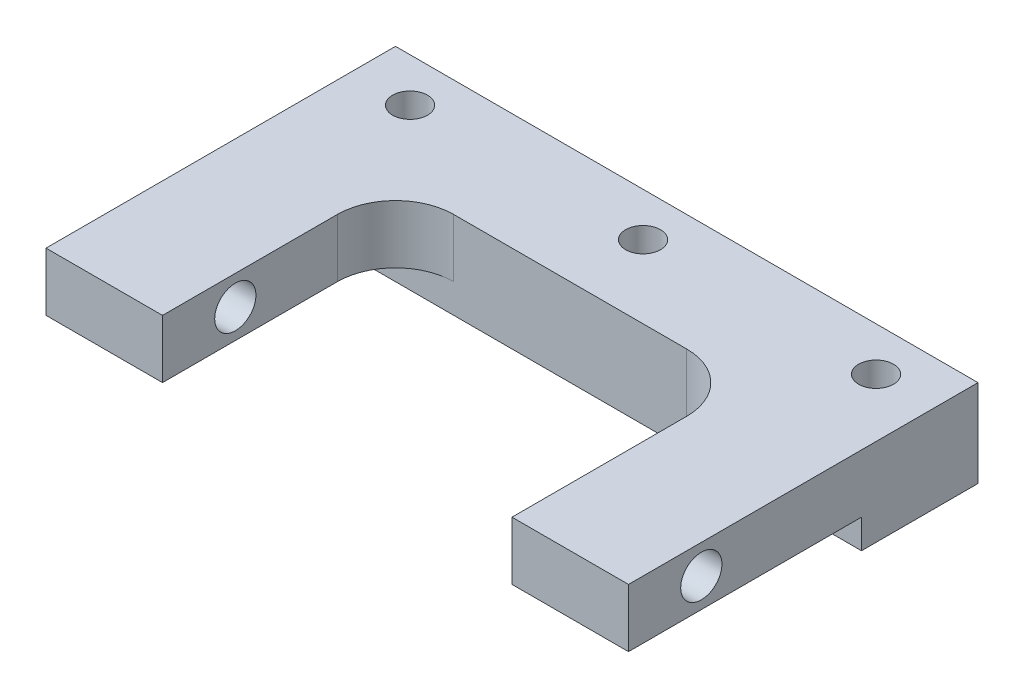
ISO-10303-21;
HEADER;
FILE_DESCRIPTION(('STEP AP214'),'2;1');
FILE_NAME('part.step','',(''),(''),'','','');
FILE_SCHEMA(('AUTOMOTIVE_DESIGN { 1 0 10303 214 1 1 1 1 }'));
ENDSEC;
DATA;
#1=APPLICATION_CONTEXT('core data for automotive mechanical design processes');
#2=APPLICATION_PROTOCOL_DEFINITION('international standard','automotive_design',2000,#1);
#3=PRODUCT_CONTEXT('',#1,'mechanical');
#4=PRODUCT('Part','Part','',(#3));
#5=PRODUCT_RELATED_PRODUCT_CATEGORY('part','',(#4));
#6=PRODUCT_DEFINITION_FORMATION('','',#4);
#7=PRODUCT_DEFINITION_CONTEXT('part definition',#1,'design');
#8=PRODUCT_DEFINITION('design','',#6,#7);
#9=PRODUCT_DEFINITION_SHAPE('','',#8);
#10=(LENGTH_UNIT() NAMED_UNIT(*) SI_UNIT(.MILLI.,.METRE.));
#11=(NAMED_UNIT(*) PLANE_ANGLE_UNIT() SI_UNIT($,.RADIAN.));
#12=(NAMED_UNIT(*) SI_UNIT($,.STERADIAN.) SOLID_ANGLE_UNIT());
#13=UNCERTAINTY_MEASURE_WITH_UNIT(LENGTH_MEASURE(1.E-05),#10,'distance_accuracy_value','');
#14=(GEOMETRIC_REPRESENTATION_CONTEXT(3) GLOBAL_UNCERTAINTY_ASSIGNED_CONTEXT((#13)) GLOBAL_UNIT_ASSIGNED_CONTEXT((#10,
#11,#12)) REPRESENTATION_CONTEXT('',''));
#15=CARTESIAN_POINT('',(0.,0.,0.));
#16=DIRECTION('',(0.,0.,1.));
#17=DIRECTION('',(1.,0.,0.));
#18=AXIS2_PLACEMENT_3D('',#15,#16,#17);
#19=CARTESIAN_POINT('',(0.,0.,12.7));
#20=DIRECTION('',(0.,0.,-1.));
#21=DIRECTION('',(-1.,0.,0.));
#22=AXIS2_PLACEMENT_3D('',#19,#20,#21);
#23=PLANE('',#22);
#24=DIRECTION('',(-1.,0.,0.));
#25=VECTOR('',#24,1.);
#26=CARTESIAN_POINT('',(0.,9.525,12.7));
#27=LINE('',#26,#25);
#28=CARTESIAN_POINT('',(44.45,9.525,12.7));
#29=VERTEX_POINT('',#28);
#30=CARTESIAN_POINT('',(19.05,9.525,12.7));
#31=VERTEX_POINT('',#30);
#32=EDGE_CURVE('E210',#29,#31,#27,.T.);
#33=ORIENTED_EDGE('',*,*,#32,.T.);
#34=DIRECTION('',(0.,1.,0.));
#35=VECTOR('',#34,1.);
#36=CARTESIAN_POINT('',(19.05,3.175,12.7));
#37=LINE('',#36,#35);
#38=CARTESIAN_POINT('',(19.05,3.175,12.7));
#39=VERTEX_POINT('',#38);
#40=EDGE_CURVE('E230',#31,#39,#37,.F.);
#41=ORIENTED_EDGE('',*,*,#40,.T.);
#42=DIRECTION('',(1.,0.,0.));
#43=VECTOR('',#42,1.);
#44=CARTESIAN_POINT('',(0.,3.175,12.7));
#45=LINE('',#44,#43);
#46=CARTESIAN_POINT('',(0.,3.175,12.7));
#47=VERTEX_POINT('',#46);
#48=EDGE_CURVE('E163',#47,#39,#45,.T.);
#49=ORIENTED_EDGE('',*,*,#48,.F.);
#50=DIRECTION('',(0.,-1.,0.));
#51=VECTOR('',#50,1.);
#52=CARTESIAN_POINT('',(0.,0.,12.7));
#53=LINE('',#52,#51);
#54=CARTESIAN_POINT('',(0.,0.,12.7));
#55=VERTEX_POINT('',#54);
#56=EDGE_CURVE('E203',#47,#55,#53,.T.);
#57=ORIENTED_EDGE('',*,*,#56,.T.);
#58=DIRECTION('',(1.,0.,0.));
#59=VECTOR('',#58,1.);
#60=CARTESIAN_POINT('',(0.,0.,12.7));
#61=LINE('',#60,#59);
#62=CARTESIAN_POINT('',(63.5,0.,12.7));
#63=VERTEX_POINT('',#62);
#64=EDGE_CURVE('E205',#55,#63,#61,.T.);
#65=ORIENTED_EDGE('',*,*,#64,.T.);
#66=DIRECTION('',(0.,1.,0.));
#67=VECTOR('',#66,1.);
#68=CARTESIAN_POINT('',(63.5,0.,12.7));
#69=LINE('',#68,#67);
#70=CARTESIAN_POINT('',(63.5,3.175,12.7));
#71=VERTEX_POINT('',#70);
#72=EDGE_CURVE('E208',#63,#71,#69,.T.);
#73=ORIENTED_EDGE('',*,*,#72,.T.);
#74=DIRECTION('',(1.,0.,0.));
#75=VECTOR('',#74,1.);
#76=CARTESIAN_POINT('',(63.5,3.175,12.7));
#77=LINE('',#76,#75);
#78=CARTESIAN_POINT('',(44.45,3.175,12.7));
#79=VERTEX_POINT('',#78);
#80=EDGE_CURVE('E147',#79,#71,#77,.T.);
#81=ORIENTED_EDGE('',*,*,#80,.F.);
#82=DIRECTION('',(0.,-1.,0.));
#83=VECTOR('',#82,1.);
#84=CARTESIAN_POINT('',(44.45,9.52500000000001,12.7));
#85=LINE('',#84,#83);
#86=EDGE_CURVE('E228',#79,#29,#85,.F.);
#87=ORIENTED_EDGE('',*,*,#86,.T.);
#88=EDGE_LOOP('',(#33,#41,#49,#57,#65,#73,#81,#87));
#89=FACE_BOUND('',#88,.T.);
#90=ADVANCED_FACE('F33',(#89),#23,.F.);
#91=CARTESIAN_POINT('',(0.,0.,12.7));
#92=DIRECTION('',(1.,0.,0.));
#93=DIRECTION('',(0.,0.,-1.));
#94=AXIS2_PLACEMENT_3D('',#91,#92,#93);
#95=PLANE('',#94);
#96=CARTESIAN_POINT('',(0.,6.35,30.1625));
#97=DIRECTION('',(-1.,0.,0.));
#98=DIRECTION('',(0.,0.,1.));
#99=AXIS2_PLACEMENT_3D('',#96,#97,#98);
#100=CIRCLE('',#99,2.24789999999999);
#101=CARTESIAN_POINT('',(0.,6.35,32.4104));
#102=VERTEX_POINT('',#101);
#103=EDGE_CURVE('E470',#102,#102,#100,.T.);
#104=ORIENTED_EDGE('',*,*,#103,.F.);
#105=EDGE_LOOP('',(#104));
#106=FACE_BOUND('',#105,.T.);
#107=DIRECTION('',(0.,-1.,0.));
#108=VECTOR('',#107,1.);
#109=CARTESIAN_POINT('',(0.,0.,0.));
#110=LINE('',#109,#108);
#111=CARTESIAN_POINT('',(0.,9.525,0.));
#112=VERTEX_POINT('',#111);
#113=CARTESIAN_POINT('',(0.,0.,0.));
#114=VERTEX_POINT('',#113);
#115=EDGE_CURVE('E202',#112,#114,#110,.T.);
#116=ORIENTED_EDGE('',*,*,#115,.T.);
#117=DIRECTION('',(0.,0.,-1.));
#118=VECTOR('',#117,1.);
#119=CARTESIAN_POINT('',(0.,0.,12.7));
#120=LINE('',#119,#118);
#121=EDGE_CURVE('E222',#55,#114,#120,.T.);
#122=ORIENTED_EDGE('',*,*,#121,.F.);
#123=ORIENTED_EDGE('',*,*,#56,.F.);
#124=DIRECTION('',(0.,0.,-1.));
#125=VECTOR('',#124,1.);
#126=CARTESIAN_POINT('',(0.,3.175,38.1));
#127=LINE('',#126,#125);
#128=CARTESIAN_POINT('',(0.,3.175,38.1));
#129=VERTEX_POINT('',#128);
#130=EDGE_CURVE('E181',#129,#47,#127,.T.);
#131=ORIENTED_EDGE('',*,*,#130,.F.);
#132=DIRECTION('',(0.,-1.,0.));
#133=VECTOR('',#132,1.);
#134=CARTESIAN_POINT('',(0.,9.525,38.1));
#135=LINE('',#134,#133);
#136=CARTESIAN_POINT('',(0.,9.525,38.1));
#137=VERTEX_POINT('',#136);
#138=EDGE_CURVE('E164',#137,#129,#135,.T.);
#139=ORIENTED_EDGE('',*,*,#138,.F.);
#140=DIRECTION('',(0.,0.,-1.));
#141=VECTOR('',#140,1.);
#142=CARTESIAN_POINT('',(0.,9.525,12.7));
#143=LINE('',#142,#141);
#144=EDGE_CURVE('E134',#137,#112,#143,.T.);
#145=ORIENTED_EDGE('',*,*,#144,.T.);
#146=EDGE_LOOP('',(#116,#122,#123,#131,#139,#145));
#147=FACE_BOUND('',#146,.T.);
#148=ADVANCED_FACE('F260',(#106,#147),#95,.F.);
#149=CARTESIAN_POINT('',(0.,0.,12.7));
#150=DIRECTION('',(0.,1.,0.));
#151=DIRECTION('',(0.,0.,1.));
#152=AXIS2_PLACEMENT_3D('',#149,#150,#151);
#153=PLANE('',#152);
#154=CARTESIAN_POINT('',(6.35,0.,4.7625));
#155=DIRECTION('',(0.,1.,0.));
#156=DIRECTION('',(0.,0.,1.));
#157=AXIS2_PLACEMENT_3D('',#154,#155,#156);
#158=CIRCLE('',#157,1.89865);
#159=CARTESIAN_POINT('',(6.35,0.,6.66115));
#160=VERTEX_POINT('',#159);
#161=EDGE_CURVE('E187',#160,#160,#158,.T.);
#162=ORIENTED_EDGE('',*,*,#161,.T.);
#163=EDGE_LOOP('',(#162));
#164=FACE_BOUND('',#163,.T.);
#165=CARTESIAN_POINT('',(31.75,0.,4.7625));
#166=DIRECTION('',(0.,1.,0.));
#167=DIRECTION('',(0.,0.,1.));
#168=AXIS2_PLACEMENT_3D('',#165,#166,#167);
#169=CIRCLE('',#168,1.89864999999999);
#170=CARTESIAN_POINT('',(31.75,0.,6.66114999999999));
#171=VERTEX_POINT('',#170);
#172=EDGE_CURVE('E193',#171,#171,#169,.T.);
#173=ORIENTED_EDGE('',*,*,#172,.T.);
#174=EDGE_LOOP('',(#173));
#175=FACE_BOUND('',#174,.T.);
#176=CARTESIAN_POINT('',(57.15,0.,4.7625));
#177=DIRECTION('',(0.,1.,0.));
#178=DIRECTION('',(0.,0.,1.));
#179=AXIS2_PLACEMENT_3D('',#176,#177,#178);
#180=CIRCLE('',#179,1.89864999999999);
#181=CARTESIAN_POINT('',(57.15,0.,6.66114999999999));
#182=VERTEX_POINT('',#181);
#183=EDGE_CURVE('E199',#182,#182,#180,.T.);
#184=ORIENTED_EDGE('',*,*,#183,.T.);
#185=EDGE_LOOP('',(#184));
#186=FACE_BOUND('',#185,.T.);
#187=DIRECTION('',(1.,0.,0.));
#188=VECTOR('',#187,1.);
#189=CARTESIAN_POINT('',(0.,0.,0.));
#190=LINE('',#189,#188);
#191=CARTESIAN_POINT('',(63.5,0.,0.));
#192=VERTEX_POINT('',#191);
#193=EDGE_CURVE('E215',#114,#192,#190,.T.);
#194=ORIENTED_EDGE('',*,*,#193,.T.);
#195=DIRECTION('',(0.,0.,-1.));
#196=VECTOR('',#195,1.);
#197=CARTESIAN_POINT('',(63.5,0.,12.7));
#198=LINE('',#197,#196);
#199=EDGE_CURVE('E133',#63,#192,#198,.T.);
#200=ORIENTED_EDGE('',*,*,#199,.F.);
#201=ORIENTED_EDGE('',*,*,#64,.F.);
#202=ORIENTED_EDGE('',*,*,#121,.T.);
#203=EDGE_LOOP('',(#194,#200,#201,#202));
#204=FACE_BOUND('',#203,.T.);
#205=ADVANCED_FACE('F264',(#164,#175,#186,#204),#153,.F.);
#206=CARTESIAN_POINT('',(63.5,0.,12.7));
#207=DIRECTION('',(-1.,0.,0.));
#208=DIRECTION('',(0.,0.,1.));
#209=AXIS2_PLACEMENT_3D('',#206,#207,#208);
#210=PLANE('',#209);
#211=CARTESIAN_POINT('',(63.5,6.35,30.1625));
#212=DIRECTION('',(-1.,0.,0.));
#213=DIRECTION('',(0.,0.,1.));
#214=AXIS2_PLACEMENT_3D('',#211,#212,#213);
#215=CIRCLE('',#214,2.24789999999999);
#216=CARTESIAN_POINT('',(63.5,6.35,32.4104));
#217=VERTEX_POINT('',#216);
#218=EDGE_CURVE('E465',#217,#217,#215,.T.);
#219=ORIENTED_EDGE('',*,*,#218,.T.);
#220=EDGE_LOOP('',(#219));
#221=FACE_BOUND('',#220,.T.);
#222=DIRECTION('',(0.,1.,0.));
#223=VECTOR('',#222,1.);
#224=CARTESIAN_POINT('',(63.5,0.,0.));
#225=LINE('',#224,#223);
#226=CARTESIAN_POINT('',(63.5,9.525,0.));
#227=VERTEX_POINT('',#226);
#228=EDGE_CURVE('E131',#192,#227,#225,.T.);
#229=ORIENTED_EDGE('',*,*,#228,.T.);
#230=DIRECTION('',(0.,0.,-1.));
#231=VECTOR('',#230,1.);
#232=CARTESIAN_POINT('',(63.5,9.525,12.7));
#233=LINE('',#232,#231);
#234=CARTESIAN_POINT('',(63.5,9.525,38.1));
#235=VERTEX_POINT('',#234);
#236=EDGE_CURVE('E123',#235,#227,#233,.T.);
#237=ORIENTED_EDGE('',*,*,#236,.F.);
#238=DIRECTION('',(0.,1.,0.));
#239=VECTOR('',#238,1.);
#240=CARTESIAN_POINT('',(63.5,9.525,38.1));
#241=LINE('',#240,#239);
#242=CARTESIAN_POINT('',(63.5,3.175,38.1));
#243=VERTEX_POINT('',#242);
#244=EDGE_CURVE('E128',#243,#235,#241,.T.);
#245=ORIENTED_EDGE('',*,*,#244,.F.);
#246=DIRECTION('',(0.,0.,-1.));
#247=VECTOR('',#246,1.);
#248=CARTESIAN_POINT('',(63.5,3.175,38.1));
#249=LINE('',#248,#247);
#250=EDGE_CURVE('E156',#243,#71,#249,.T.);
#251=ORIENTED_EDGE('',*,*,#250,.T.);
#252=ORIENTED_EDGE('',*,*,#72,.F.);
#253=ORIENTED_EDGE('',*,*,#199,.T.);
#254=EDGE_LOOP('',(#229,#237,#245,#251,#252,#253));
#255=FACE_BOUND('',#254,.T.);
#256=ADVANCED_FACE('F125',(#221,#255),#210,.F.);
#257=CARTESIAN_POINT('',(0.,9.525,12.7));
#258=DIRECTION('',(0.,-1.,0.));
#259=DIRECTION('',(0.,0.,-1.));
#260=AXIS2_PLACEMENT_3D('',#257,#258,#259);
#261=PLANE('',#260);
#262=CARTESIAN_POINT('',(6.35,9.525,4.7625));
#263=DIRECTION('',(0.,1.,0.));
#264=DIRECTION('',(0.,0.,1.));
#265=AXIS2_PLACEMENT_3D('',#262,#263,#264);
#266=CIRCLE('',#265,1.89865);
#267=CARTESIAN_POINT('',(6.35,9.525,6.66115));
#268=VERTEX_POINT('',#267);
#269=EDGE_CURVE('E184',#268,#268,#266,.T.);
#270=ORIENTED_EDGE('',*,*,#269,.F.);
#271=EDGE_LOOP('',(#270));
#272=FACE_BOUND('',#271,.T.);
#273=CARTESIAN_POINT('',(31.75,9.525,4.7625));
#274=DIRECTION('',(0.,1.,0.));
#275=DIRECTION('',(0.,0.,1.));
#276=AXIS2_PLACEMENT_3D('',#273,#274,#275);
#277=CIRCLE('',#276,1.89864999999999);
#278=CARTESIAN_POINT('',(31.75,9.525,6.66114999999999));
#279=VERTEX_POINT('',#278);
#280=EDGE_CURVE('E190',#279,#279,#277,.T.);
#281=ORIENTED_EDGE('',*,*,#280,.F.);
#282=EDGE_LOOP('',(#281));
#283=FACE_BOUND('',#282,.T.);
#284=CARTESIAN_POINT('',(57.15,9.525,4.7625));
#285=DIRECTION('',(0.,1.,0.));
#286=DIRECTION('',(0.,0.,1.));
#287=AXIS2_PLACEMENT_3D('',#284,#285,#286);
#288=CIRCLE('',#287,1.89864999999999);
#289=CARTESIAN_POINT('',(57.15,9.525,6.66114999999999));
#290=VERTEX_POINT('',#289);
#291=EDGE_CURVE('E196',#290,#290,#288,.T.);
#292=ORIENTED_EDGE('',*,*,#291,.F.);
#293=EDGE_LOOP('',(#292));
#294=FACE_BOUND('',#293,.T.);
#295=DIRECTION('',(-1.,0.,0.));
#296=VECTOR('',#295,1.);
#297=CARTESIAN_POINT('',(0.,9.525,0.));
#298=LINE('',#297,#296);
#299=EDGE_CURVE('E206',#227,#112,#298,.T.);
#300=ORIENTED_EDGE('',*,*,#299,.T.);
#301=ORIENTED_EDGE('',*,*,#144,.F.);
#302=DIRECTION('',(-1.,0.,0.));
#303=VECTOR('',#302,1.);
#304=CARTESIAN_POINT('',(0.,9.525,38.1));
#305=LINE('',#304,#303);
#306=CARTESIAN_POINT('',(12.7,9.525,38.1));
#307=VERTEX_POINT('',#306);
#308=EDGE_CURVE('E171',#307,#137,#305,.T.);
#309=ORIENTED_EDGE('',*,*,#308,.F.);
#310=DIRECTION('',(0.,0.,-1.));
#311=VECTOR('',#310,1.);
#312=CARTESIAN_POINT('',(12.7,9.525,38.1));
#313=LINE('',#312,#311);
#314=CARTESIAN_POINT('',(12.7,9.525,19.05));
#315=VERTEX_POINT('',#314);
#316=EDGE_CURVE('E174',#307,#315,#313,.T.);
#317=ORIENTED_EDGE('',*,*,#316,.T.);
#318=CARTESIAN_POINT('',(19.05,9.525,19.05));
#319=DIRECTION('',(0.,-1.,0.));
#320=DIRECTION('',(0.,0.,-1.));
#321=AXIS2_PLACEMENT_3D('',#318,#319,#320);
#322=CIRCLE('',#321,6.35);
#323=EDGE_CURVE('E235',#315,#31,#322,.T.);
#324=ORIENTED_EDGE('',*,*,#323,.T.);
#325=ORIENTED_EDGE('',*,*,#32,.F.);
#326=CARTESIAN_POINT('',(44.45,9.525,19.05));
#327=DIRECTION('',(0.,-1.,0.));
#328=DIRECTION('',(0.,0.,-1.));
#329=AXIS2_PLACEMENT_3D('',#326,#327,#328);
#330=CIRCLE('',#329,6.35);
#331=CARTESIAN_POINT('',(50.8,9.525,19.05));
#332=VERTEX_POINT('',#331);
#333=EDGE_CURVE('E11',#29,#332,#330,.T.);
#334=ORIENTED_EDGE('',*,*,#333,.T.);
#335=DIRECTION('',(0.,0.,-1.));
#336=VECTOR('',#335,1.);
#337=CARTESIAN_POINT('',(50.8,9.525,38.1));
#338=LINE('',#337,#336);
#339=CARTESIAN_POINT('',(50.8,9.525,38.1));
#340=VERTEX_POINT('',#339);
#341=EDGE_CURVE('E138',#340,#332,#338,.T.);
#342=ORIENTED_EDGE('',*,*,#341,.F.);
#343=DIRECTION('',(-1.,0.,0.));
#344=VECTOR('',#343,1.);
#345=CARTESIAN_POINT('',(63.5,9.525,38.1));
#346=LINE('',#345,#344);
#347=EDGE_CURVE('E136',#235,#340,#346,.T.);
#348=ORIENTED_EDGE('',*,*,#347,.F.);
#349=ORIENTED_EDGE('',*,*,#236,.T.);
#350=EDGE_LOOP('',(#300,#301,#309,#317,#324,#325,#334,#342,#348,#349));
#351=FACE_BOUND('',#350,.T.);
#352=ADVANCED_FACE('F137',(#272,#283,#294,#351),#261,.F.);
#353=CARTESIAN_POINT('',(0.,0.,0.));
#354=DIRECTION('',(0.,0.,-1.));
#355=DIRECTION('',(-1.,0.,0.));
#356=AXIS2_PLACEMENT_3D('',#353,#354,#355);
#357=PLANE('',#356);
#358=ORIENTED_EDGE('',*,*,#115,.F.);
#359=ORIENTED_EDGE('',*,*,#299,.F.);
#360=ORIENTED_EDGE('',*,*,#228,.F.);
#361=ORIENTED_EDGE('',*,*,#193,.F.);
#362=EDGE_LOOP('',(#358,#359,#360,#361));
#363=FACE_BOUND('',#362,.T.);
#364=ADVANCED_FACE('F268',(#363),#357,.T.);
#365=CARTESIAN_POINT('',(57.15,9.525,4.7625));
#366=DIRECTION('',(0.,1.,0.));
#367=DIRECTION('',(0.,0.,1.));
#368=AXIS2_PLACEMENT_3D('',#365,#366,#367);
#369=CYLINDRICAL_SURFACE('',#368,1.89864999999999);
#370=ORIENTED_EDGE('',*,*,#183,.F.);
#371=EDGE_LOOP('',(#370));
#372=FACE_BOUND('',#371,.T.);
#373=ORIENTED_EDGE('',*,*,#291,.T.);
#374=EDGE_LOOP('',(#373));
#375=FACE_BOUND('',#374,.T.);
#376=ADVANCED_FACE('F291',(#372,#375),#369,.F.);
#377=CARTESIAN_POINT('',(31.75,9.525,4.7625));
#378=DIRECTION('',(0.,1.,0.));
#379=DIRECTION('',(0.,0.,1.));
#380=AXIS2_PLACEMENT_3D('',#377,#378,#379);
#381=CYLINDRICAL_SURFACE('',#380,1.89864999999999);
#382=ORIENTED_EDGE('',*,*,#172,.F.);
#383=EDGE_LOOP('',(#382));
#384=FACE_BOUND('',#383,.T.);
#385=ORIENTED_EDGE('',*,*,#280,.T.);
#386=EDGE_LOOP('',(#385));
#387=FACE_BOUND('',#386,.T.);
#388=ADVANCED_FACE('F391',(#384,#387),#381,.F.);
#389=CARTESIAN_POINT('',(6.35,9.525,4.7625));
#390=DIRECTION('',(0.,1.,0.));
#391=DIRECTION('',(0.,0.,1.));
#392=AXIS2_PLACEMENT_3D('',#389,#390,#391);
#393=CYLINDRICAL_SURFACE('',#392,1.89865);
#394=ORIENTED_EDGE('',*,*,#161,.F.);
#395=EDGE_LOOP('',(#394));
#396=FACE_BOUND('',#395,.T.);
#397=ORIENTED_EDGE('',*,*,#269,.T.);
#398=EDGE_LOOP('',(#397));
#399=FACE_BOUND('',#398,.T.);
#400=ADVANCED_FACE('F365',(#396,#399),#393,.F.);
#401=CARTESIAN_POINT('',(0.,3.175,38.1));
#402=DIRECTION('',(0.,1.,0.));
#403=DIRECTION('',(0.,0.,1.));
#404=AXIS2_PLACEMENT_3D('',#401,#402,#403);
#405=PLANE('',#404);
#406=ORIENTED_EDGE('',*,*,#48,.T.);
#407=CARTESIAN_POINT('',(19.05,3.175,19.05));
#408=DIRECTION('',(0.,1.,0.));
#409=DIRECTION('',(0.,0.,1.));
#410=AXIS2_PLACEMENT_3D('',#407,#408,#409);
#411=CIRCLE('',#410,6.35);
#412=CARTESIAN_POINT('',(12.7,3.175,19.05));
#413=VERTEX_POINT('',#412);
#414=EDGE_CURVE('E237',#39,#413,#411,.T.);
#415=ORIENTED_EDGE('',*,*,#414,.T.);
#416=DIRECTION('',(0.,0.,-1.));
#417=VECTOR('',#416,1.);
#418=CARTESIAN_POINT('',(12.7,3.175,38.1));
#419=LINE('',#418,#417);
#420=CARTESIAN_POINT('',(12.7,3.175,38.1));
#421=VERTEX_POINT('',#420);
#422=EDGE_CURVE('E178',#421,#413,#419,.T.);
#423=ORIENTED_EDGE('',*,*,#422,.F.);
#424=DIRECTION('',(1.,0.,0.));
#425=VECTOR('',#424,1.);
#426=CARTESIAN_POINT('',(0.,3.175,38.1));
#427=LINE('',#426,#425);
#428=EDGE_CURVE('E167',#129,#421,#427,.T.);
#429=ORIENTED_EDGE('',*,*,#428,.F.);
#430=ORIENTED_EDGE('',*,*,#130,.T.);
#431=EDGE_LOOP('',(#406,#415,#423,#429,#430));
#432=FACE_BOUND('',#431,.T.);
#433=ADVANCED_FACE('F254',(#432),#405,.F.);
#434=CARTESIAN_POINT('',(12.7,9.525,38.1));
#435=DIRECTION('',(-1.,0.,0.));
#436=DIRECTION('',(0.,-1.,0.));
#437=AXIS2_PLACEMENT_3D('',#434,#435,#436);
#438=PLANE('',#437);
#439=CARTESIAN_POINT('',(12.7,6.35,30.1625));
#440=DIRECTION('',(-1.,0.,0.));
#441=DIRECTION('',(0.,-1.,0.));
#442=AXIS2_PLACEMENT_3D('',#439,#440,#441);
#443=CIRCLE('',#442,2.24789999999999);
#444=CARTESIAN_POINT('',(12.7,4.10210000000001,30.1625));
#445=VERTEX_POINT('',#444);
#446=EDGE_CURVE('E150',#445,#445,#443,.T.);
#447=ORIENTED_EDGE('',*,*,#446,.T.);
#448=EDGE_LOOP('',(#447));
#449=FACE_BOUND('',#448,.T.);
#450=ORIENTED_EDGE('',*,*,#422,.T.);
#451=DIRECTION('',(0.,1.,0.));
#452=VECTOR('',#451,1.);
#453=CARTESIAN_POINT('',(12.7,9.525,19.05));
#454=LINE('',#453,#452);
#455=EDGE_CURVE('E225',#413,#315,#454,.T.);
#456=ORIENTED_EDGE('',*,*,#455,.T.);
#457=ORIENTED_EDGE('',*,*,#316,.F.);
#458=DIRECTION('',(0.,1.,0.));
#459=VECTOR('',#458,1.);
#460=CARTESIAN_POINT('',(12.7,9.525,38.1));
#461=LINE('',#460,#459);
#462=EDGE_CURVE('E169',#421,#307,#461,.T.);
#463=ORIENTED_EDGE('',*,*,#462,.F.);
#464=EDGE_LOOP('',(#450,#456,#457,#463));
#465=FACE_BOUND('',#464,.T.);
#466=ADVANCED_FACE('F250',(#449,#465),#438,.F.);
#467=CARTESIAN_POINT('',(0.,0.,38.1));
#468=DIRECTION('',(0.,0.,1.));
#469=DIRECTION('',(1.,0.,0.));
#470=AXIS2_PLACEMENT_3D('',#467,#468,#469);
#471=PLANE('',#470);
#472=ORIENTED_EDGE('',*,*,#138,.T.);
#473=ORIENTED_EDGE('',*,*,#428,.T.);
#474=ORIENTED_EDGE('',*,*,#462,.T.);
#475=ORIENTED_EDGE('',*,*,#308,.T.);
#476=EDGE_LOOP('',(#472,#473,#474,#475));
#477=FACE_BOUND('',#476,.T.);
#478=ADVANCED_FACE('F270',(#477),#471,.T.);
#479=CARTESIAN_POINT('',(50.8,9.525,38.1));
#480=DIRECTION('',(1.,0.,0.));
#481=DIRECTION('',(0.,1.,0.));
#482=AXIS2_PLACEMENT_3D('',#479,#480,#481);
#483=PLANE('',#482);
#484=CARTESIAN_POINT('',(50.8,6.35,30.1625));
#485=DIRECTION('',(1.,0.,0.));
#486=DIRECTION('',(0.,1.,0.));
#487=AXIS2_PLACEMENT_3D('',#484,#485,#486);
#488=CIRCLE('',#487,2.24789999999999);
#489=CARTESIAN_POINT('',(50.8,8.59789999999999,30.1625));
#490=VERTEX_POINT('',#489);
#491=EDGE_CURVE('E468',#490,#490,#488,.T.);
#492=ORIENTED_EDGE('',*,*,#491,.T.);
#493=EDGE_LOOP('',(#492));
#494=FACE_BOUND('',#493,.T.);
#495=ORIENTED_EDGE('',*,*,#341,.T.);
#496=DIRECTION('',(0.,-1.,0.));
#497=VECTOR('',#496,1.);
#498=CARTESIAN_POINT('',(50.8,3.175,19.05));
#499=LINE('',#498,#497);
#500=CARTESIAN_POINT('',(50.8,3.175,19.05));
#501=VERTEX_POINT('',#500);
#502=EDGE_CURVE('E233',#332,#501,#499,.T.);
#503=ORIENTED_EDGE('',*,*,#502,.T.);
#504=DIRECTION('',(0.,0.,-1.));
#505=VECTOR('',#504,1.);
#506=CARTESIAN_POINT('',(50.8,3.175,38.1));
#507=LINE('',#506,#505);
#508=CARTESIAN_POINT('',(50.8,3.175,38.1));
#509=VERTEX_POINT('',#508);
#510=EDGE_CURVE('E159',#509,#501,#507,.T.);
#511=ORIENTED_EDGE('',*,*,#510,.F.);
#512=DIRECTION('',(0.,-1.,0.));
#513=VECTOR('',#512,1.);
#514=CARTESIAN_POINT('',(50.8,9.525,38.1));
#515=LINE('',#514,#513);
#516=EDGE_CURVE('E141',#340,#509,#515,.T.);
#517=ORIENTED_EDGE('',*,*,#516,.F.);
#518=EDGE_LOOP('',(#495,#503,#511,#517));
#519=FACE_BOUND('',#518,.T.);
#520=ADVANCED_FACE('F272',(#494,#519),#483,.F.);
#521=CARTESIAN_POINT('',(63.5,3.175,38.1));
#522=DIRECTION('',(0.,1.,0.));
#523=DIRECTION('',(-1.,0.,0.));
#524=AXIS2_PLACEMENT_3D('',#521,#522,#523);
#525=PLANE('',#524);
#526=ORIENTED_EDGE('',*,*,#80,.T.);
#527=ORIENTED_EDGE('',*,*,#250,.F.);
#528=DIRECTION('',(1.,0.,0.));
#529=VECTOR('',#528,1.);
#530=CARTESIAN_POINT('',(63.5,3.175,38.1));
#531=LINE('',#530,#529);
#532=EDGE_CURVE('E145',#509,#243,#531,.T.);
#533=ORIENTED_EDGE('',*,*,#532,.F.);
#534=ORIENTED_EDGE('',*,*,#510,.T.);
#535=CARTESIAN_POINT('',(44.45,3.175,19.05));
#536=DIRECTION('',(0.,1.,0.));
#537=DIRECTION('',(-1.,0.,0.));
#538=AXIS2_PLACEMENT_3D('',#535,#536,#537);
#539=CIRCLE('',#538,6.35);
#540=EDGE_CURVE('E41',#501,#79,#539,.T.);
#541=ORIENTED_EDGE('',*,*,#540,.T.);
#542=EDGE_LOOP('',(#526,#527,#533,#534,#541));
#543=FACE_BOUND('',#542,.T.);
#544=ADVANCED_FACE('F239',(#543),#525,.F.);
#545=CARTESIAN_POINT('',(0.,0.,38.1));
#546=DIRECTION('',(0.,0.,-1.));
#547=DIRECTION('',(-1.,0.,0.));
#548=AXIS2_PLACEMENT_3D('',#545,#546,#547);
#549=PLANE('',#548);
#550=ORIENTED_EDGE('',*,*,#244,.T.);
#551=ORIENTED_EDGE('',*,*,#347,.T.);
#552=ORIENTED_EDGE('',*,*,#516,.T.);
#553=ORIENTED_EDGE('',*,*,#532,.T.);
#554=EDGE_LOOP('',(#550,#551,#552,#553));
#555=FACE_BOUND('',#554,.T.);
#556=ADVANCED_FACE('F143',(#555),#549,.F.);
#557=CARTESIAN_POINT('',(0.,6.35,30.1625));
#558=DIRECTION('',(-1.,0.,0.));
#559=DIRECTION('',(0.,0.,1.));
#560=AXIS2_PLACEMENT_3D('',#557,#558,#559);
#561=CYLINDRICAL_SURFACE('',#560,2.24789999999999);
#562=ORIENTED_EDGE('',*,*,#103,.T.);
#563=EDGE_LOOP('',(#562));
#564=FACE_BOUND('',#563,.T.);
#565=ORIENTED_EDGE('',*,*,#446,.F.);
#566=EDGE_LOOP('',(#565));
#567=FACE_BOUND('',#566,.T.);
#568=ADVANCED_FACE('F309',(#564,#567),#561,.F.);
#569=ORIENTED_EDGE('',*,*,#218,.F.);
#570=EDGE_LOOP('',(#569));
#571=FACE_BOUND('',#570,.T.);
#572=ORIENTED_EDGE('',*,*,#491,.F.);
#573=EDGE_LOOP('',(#572));
#574=FACE_BOUND('',#573,.T.);
#575=ADVANCED_FACE('F304',(#571,#574),#561,.F.);
#576=CARTESIAN_POINT('',(19.05,9.525,19.05));
#577=DIRECTION('',(0.,-1.,0.));
#578=DIRECTION('',(1.,0.,0.));
#579=AXIS2_PLACEMENT_3D('',#576,#577,#578);
#580=CYLINDRICAL_SURFACE('',#579,6.35);
#581=ORIENTED_EDGE('',*,*,#414,.F.);
#582=ORIENTED_EDGE('',*,*,#40,.F.);
#583=ORIENTED_EDGE('',*,*,#323,.F.);
#584=ORIENTED_EDGE('',*,*,#455,.F.);
#585=EDGE_LOOP('',(#581,#582,#583,#584));
#586=FACE_BOUND('',#585,.T.);
#587=ADVANCED_FACE('F248',(#586),#580,.F.);
#588=CARTESIAN_POINT('',(44.45,9.52500000000001,19.05));
#589=DIRECTION('',(0.,1.,0.));
#590=DIRECTION('',(-1.,0.,0.));
#591=AXIS2_PLACEMENT_3D('',#588,#589,#590);
#592=CYLINDRICAL_SURFACE('',#591,6.35);
#593=ORIENTED_EDGE('',*,*,#333,.F.);
#594=ORIENTED_EDGE('',*,*,#86,.F.);
#595=ORIENTED_EDGE('',*,*,#540,.F.);
#596=ORIENTED_EDGE('',*,*,#502,.F.);
#597=EDGE_LOOP('',(#593,#594,#595,#596));
#598=FACE_BOUND('',#597,.T.);
#599=ADVANCED_FACE('F35',(#598),#592,.F.);
#600=CLOSED_SHELL('',(#90,#148,#205,#256,#352,#364,#376,#388,#400,#433,#466,#478,#520,#544,#556,
#568,#575,#587,#599));
#601=MANIFOLD_SOLID_BREP('B2',#600);
#602=ADVANCED_BREP_SHAPE_REPRESENTATION('',(#18,#601),#14);
#603=SHAPE_DEFINITION_REPRESENTATION(#9,#602);
ENDSEC;
END-ISO-10303-21;
